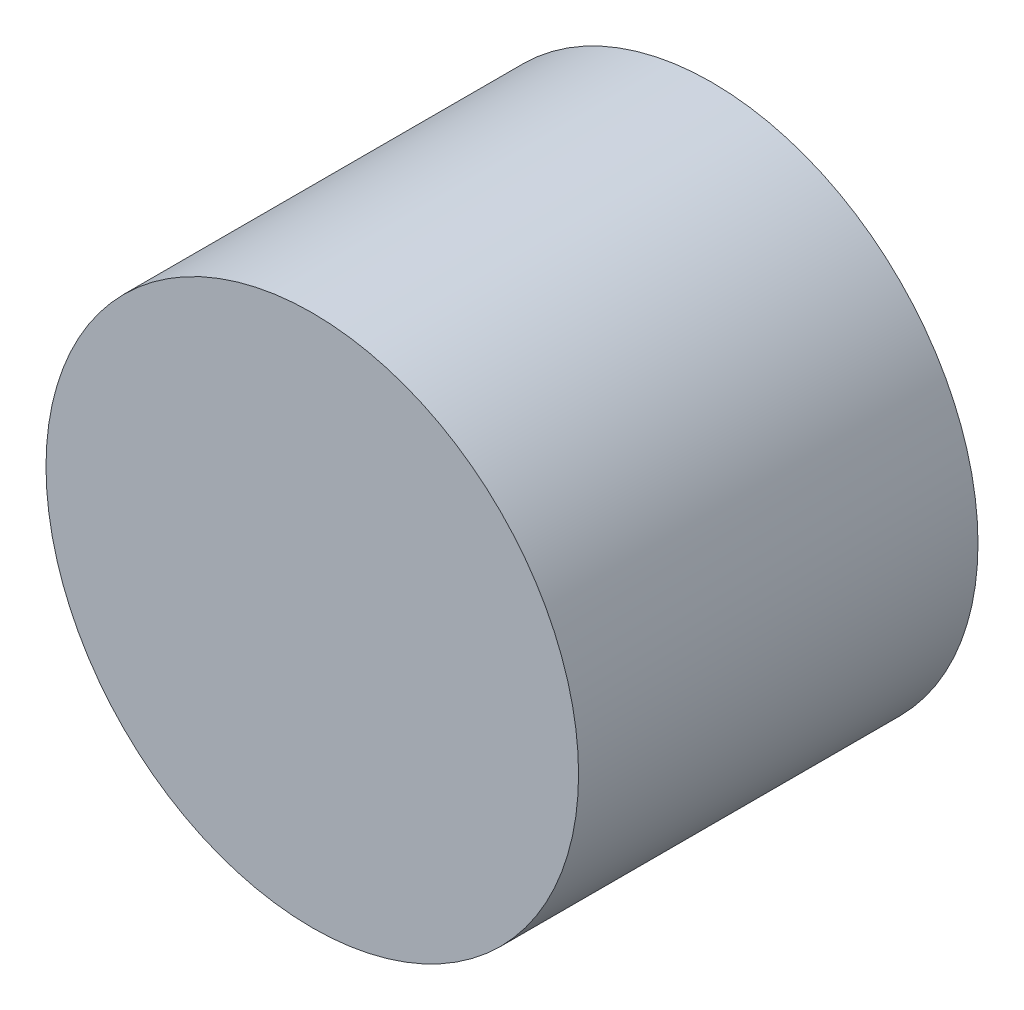
ISO-10303-21;
HEADER;
FILE_DESCRIPTION(('STEP AP214'),'2;1');
FILE_NAME('part.step','',(''),(''),'','','');
FILE_SCHEMA(('AUTOMOTIVE_DESIGN { 1 0 10303 214 1 1 1 1 }'));
ENDSEC;
DATA;
#1=APPLICATION_CONTEXT('core data for automotive mechanical design processes');
#2=APPLICATION_PROTOCOL_DEFINITION('international standard','automotive_design',2000,#1);
#3=PRODUCT_CONTEXT('',#1,'mechanical');
#4=PRODUCT('Part','Part','',(#3));
#5=PRODUCT_RELATED_PRODUCT_CATEGORY('part','',(#4));
#6=PRODUCT_DEFINITION_FORMATION('','',#4);
#7=PRODUCT_DEFINITION_CONTEXT('part definition',#1,'design');
#8=PRODUCT_DEFINITION('design','',#6,#7);
#9=PRODUCT_DEFINITION_SHAPE('','',#8);
#10=(LENGTH_UNIT() NAMED_UNIT(*) SI_UNIT(.MILLI.,.METRE.));
#11=(NAMED_UNIT(*) PLANE_ANGLE_UNIT() SI_UNIT($,.RADIAN.));
#12=(NAMED_UNIT(*) SI_UNIT($,.STERADIAN.) SOLID_ANGLE_UNIT());
#13=UNCERTAINTY_MEASURE_WITH_UNIT(LENGTH_MEASURE(1.E-05),#10,'distance_accuracy_value','');
#14=(GEOMETRIC_REPRESENTATION_CONTEXT(3) GLOBAL_UNCERTAINTY_ASSIGNED_CONTEXT((#13)) GLOBAL_UNIT_ASSIGNED_CONTEXT((#10,
#11,#12)) REPRESENTATION_CONTEXT('',''));
#15=CARTESIAN_POINT('',(0.,0.,0.));
#16=DIRECTION('',(0.,0.,1.));
#17=DIRECTION('',(1.,0.,0.));
#18=AXIS2_PLACEMENT_3D('',#15,#16,#17);
#19=CARTESIAN_POINT('',(0.,0.,60.));
#20=DIRECTION('',(0.,0.,-1.));
#21=DIRECTION('',(-1.,0.,0.));
#22=AXIS2_PLACEMENT_3D('',#19,#20,#21);
#23=CYLINDRICAL_SURFACE('',#22,40.);
#24=CARTESIAN_POINT('',(0.,0.,60.));
#25=DIRECTION('',(0.,0.,1.));
#26=DIRECTION('',(1.,0.,0.));
#27=AXIS2_PLACEMENT_3D('',#24,#25,#26);
#28=CIRCLE('',#27,40.);
#29=CARTESIAN_POINT('',(40.,0.,60.));
#30=VERTEX_POINT('',#29);
#31=EDGE_CURVE('E10',#30,#30,#28,.T.);
#32=ORIENTED_EDGE('',*,*,#31,.F.);
#33=EDGE_LOOP('',(#32));
#34=FACE_BOUND('',#33,.T.);
#35=CARTESIAN_POINT('',(0.,0.,0.));
#36=DIRECTION('',(0.,0.,1.));
#37=DIRECTION('',(1.,0.,0.));
#38=AXIS2_PLACEMENT_3D('',#35,#36,#37);
#39=CIRCLE('',#38,40.);
#40=CARTESIAN_POINT('',(40.,0.,0.));
#41=VERTEX_POINT('',#40);
#42=EDGE_CURVE('E34',#41,#41,#39,.T.);
#43=ORIENTED_EDGE('',*,*,#42,.T.);
#44=EDGE_LOOP('',(#43));
#45=FACE_BOUND('',#44,.T.);
#46=ADVANCED_FACE('F31',(#34,#45),#23,.T.);
#47=CARTESIAN_POINT('',(0.,0.,60.));
#48=DIRECTION('',(0.,0.,1.));
#49=DIRECTION('',(1.,0.,0.));
#50=AXIS2_PLACEMENT_3D('',#47,#48,#49);
#51=PLANE('',#50);
#52=ORIENTED_EDGE('',*,*,#31,.T.);
#53=EDGE_LOOP('',(#52));
#54=FACE_BOUND('',#53,.T.);
#55=ADVANCED_FACE('F46',(#54),#51,.T.);
#56=CARTESIAN_POINT('',(0.,0.,0.));
#57=DIRECTION('',(0.,0.,1.));
#58=DIRECTION('',(1.,0.,0.));
#59=AXIS2_PLACEMENT_3D('',#56,#57,#58);
#60=PLANE('',#59);
#61=ORIENTED_EDGE('',*,*,#42,.F.);
#62=EDGE_LOOP('',(#61));
#63=FACE_BOUND('',#62,.T.);
#64=ADVANCED_FACE('F44',(#63),#60,.F.);
#65=CLOSED_SHELL('',(#46,#55,#64));
#66=MANIFOLD_SOLID_BREP('B2',#65);
#67=ADVANCED_BREP_SHAPE_REPRESENTATION('',(#18,#66),#14);
#68=SHAPE_DEFINITION_REPRESENTATION(#9,#67);
ENDSEC;
END-ISO-10303-21;
